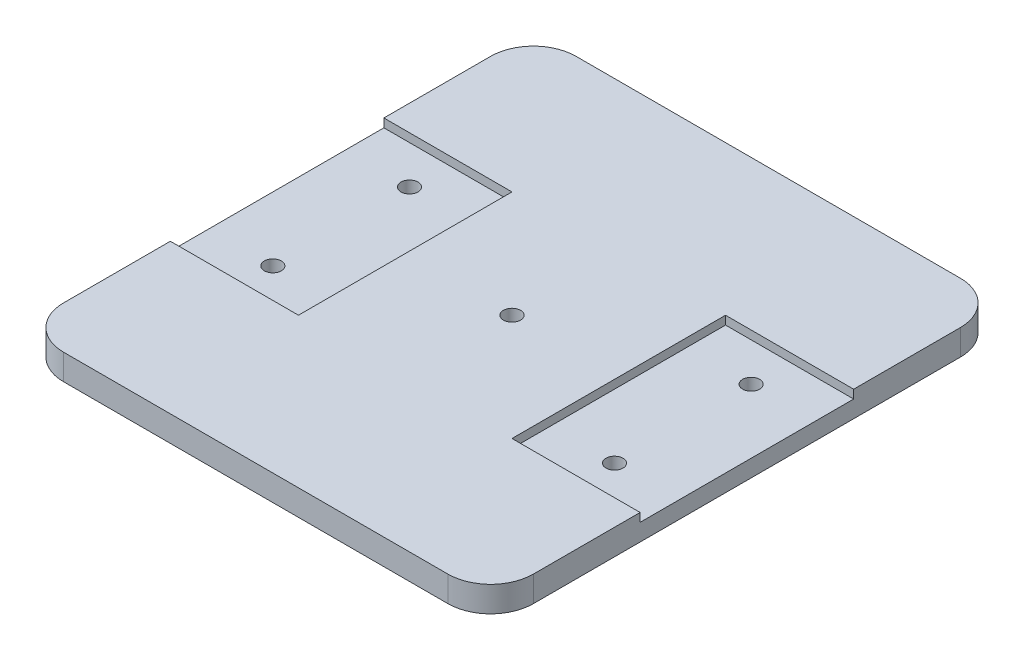
ISO-10303-21;
HEADER;
FILE_DESCRIPTION(('STEP AP214'),'2;1');
FILE_NAME('part.step','',(''),(''),'','','');
FILE_SCHEMA(('AUTOMOTIVE_DESIGN { 1 0 10303 214 1 1 1 1 }'));
ENDSEC;
DATA;
#1=APPLICATION_CONTEXT('core data for automotive mechanical design processes');
#2=APPLICATION_PROTOCOL_DEFINITION('international standard','automotive_design',2000,#1);
#3=PRODUCT_CONTEXT('',#1,'mechanical');
#4=PRODUCT('Part','Part','',(#3));
#5=PRODUCT_RELATED_PRODUCT_CATEGORY('part','',(#4));
#6=PRODUCT_DEFINITION_FORMATION('','',#4);
#7=PRODUCT_DEFINITION_CONTEXT('part definition',#1,'design');
#8=PRODUCT_DEFINITION('design','',#6,#7);
#9=PRODUCT_DEFINITION_SHAPE('','',#8);
#10=(LENGTH_UNIT() NAMED_UNIT(*) SI_UNIT(.MILLI.,.METRE.));
#11=(NAMED_UNIT(*) PLANE_ANGLE_UNIT() SI_UNIT($,.RADIAN.));
#12=(NAMED_UNIT(*) SI_UNIT($,.STERADIAN.) SOLID_ANGLE_UNIT());
#13=UNCERTAINTY_MEASURE_WITH_UNIT(LENGTH_MEASURE(1.E-05),#10,'distance_accuracy_value','');
#14=(GEOMETRIC_REPRESENTATION_CONTEXT(3) GLOBAL_UNCERTAINTY_ASSIGNED_CONTEXT((#13)) GLOBAL_UNIT_ASSIGNED_CONTEXT((#10,
#11,#12)) REPRESENTATION_CONTEXT('',''));
#15=CARTESIAN_POINT('',(0.,0.,0.));
#16=DIRECTION('',(0.,0.,1.));
#17=DIRECTION('',(1.,0.,0.));
#18=AXIS2_PLACEMENT_3D('',#15,#16,#17);
#19=CARTESIAN_POINT('',(-78.125,3.,-24.375));
#20=DIRECTION('',(1.,0.,0.));
#21=DIRECTION('',(0.,0.,-1.));
#22=AXIS2_PLACEMENT_3D('',#19,#20,#21);
#23=PLANE('',#22);
#24=DIRECTION('',(0.,0.,1.));
#25=VECTOR('',#24,1.);
#26=CARTESIAN_POINT('',(-78.125,3.,-24.375));
#27=LINE('',#26,#25);
#28=CARTESIAN_POINT('',(-78.125,3.,-19.375));
#29=VERTEX_POINT('',#28);
#30=CARTESIAN_POINT('',(-78.125,3.,-6.875));
#31=VERTEX_POINT('',#30);
#32=EDGE_CURVE('E243',#29,#31,#27,.T.);
#33=ORIENTED_EDGE('',*,*,#32,.F.);
#34=DIRECTION('',(0.,-1.,0.));
#35=VECTOR('',#34,1.);
#36=CARTESIAN_POINT('',(-78.125,3.,-19.375));
#37=LINE('',#36,#35);
#38=CARTESIAN_POINT('',(-78.125,0.,-19.375));
#39=VERTEX_POINT('',#38);
#40=EDGE_CURVE('E283',#29,#39,#37,.T.);
#41=ORIENTED_EDGE('',*,*,#40,.T.);
#42=DIRECTION('',(0.,0.,1.));
#43=VECTOR('',#42,1.);
#44=CARTESIAN_POINT('',(-78.125,0.,-24.375));
#45=LINE('',#44,#43);
#46=CARTESIAN_POINT('',(-78.125,0.,30.625));
#47=VERTEX_POINT('',#46);
#48=EDGE_CURVE('E234',#39,#47,#45,.T.);
#49=ORIENTED_EDGE('',*,*,#48,.T.);
#50=DIRECTION('',(0.,-1.,0.));
#51=VECTOR('',#50,1.);
#52=CARTESIAN_POINT('',(-78.125,3.,30.625));
#53=LINE('',#52,#51);
#54=CARTESIAN_POINT('',(-78.125,3.,30.625));
#55=VERTEX_POINT('',#54);
#56=EDGE_CURVE('E259',#47,#55,#53,.F.);
#57=ORIENTED_EDGE('',*,*,#56,.T.);
#58=CARTESIAN_POINT('',(-78.125,3.,18.125));
#59=VERTEX_POINT('',#58);
#60=EDGE_CURVE('E247',#59,#55,#27,.T.);
#61=ORIENTED_EDGE('',*,*,#60,.F.);
#62=DIRECTION('',(0.,1.,0.));
#63=VECTOR('',#62,1.);
#64=CARTESIAN_POINT('',(-78.125,2.,18.125));
#65=LINE('',#64,#63);
#66=CARTESIAN_POINT('',(-78.125,2.,18.125));
#67=VERTEX_POINT('',#66);
#68=EDGE_CURVE('E219',#67,#59,#65,.T.);
#69=ORIENTED_EDGE('',*,*,#68,.F.);
#70=DIRECTION('',(0.,0.,1.));
#71=VECTOR('',#70,1.);
#72=CARTESIAN_POINT('',(-78.125,2.,-6.875));
#73=LINE('',#72,#71);
#74=CARTESIAN_POINT('',(-78.125,2.,-6.875));
#75=VERTEX_POINT('',#74);
#76=EDGE_CURVE('E202',#75,#67,#73,.T.);
#77=ORIENTED_EDGE('',*,*,#76,.F.);
#78=DIRECTION('',(0.,1.,0.));
#79=VECTOR('',#78,1.);
#80=CARTESIAN_POINT('',(-78.125,2.,-6.875));
#81=LINE('',#80,#79);
#82=EDGE_CURVE('E230',#75,#31,#81,.T.);
#83=ORIENTED_EDGE('',*,*,#82,.T.);
#84=EDGE_LOOP('',(#33,#41,#49,#57,#61,#69,#77,#83));
#85=FACE_BOUND('',#84,.T.);
#86=ADVANCED_FACE('F42',(#85),#23,.F.);
#87=CARTESIAN_POINT('',(-78.125,3.,35.625));
#88=DIRECTION('',(0.,0.,-1.));
#89=DIRECTION('',(-1.,0.,0.));
#90=AXIS2_PLACEMENT_3D('',#87,#88,#89);
#91=PLANE('',#90);
#92=DIRECTION('',(1.,0.,0.));
#93=VECTOR('',#92,1.);
#94=CARTESIAN_POINT('',(-78.125,0.,35.625));
#95=LINE('',#94,#93);
#96=CARTESIAN_POINT('',(-73.125,0.,35.625));
#97=VERTEX_POINT('',#96);
#98=CARTESIAN_POINT('',(-28.125,0.,35.625));
#99=VERTEX_POINT('',#98);
#100=EDGE_CURVE('E263',#97,#99,#95,.T.);
#101=ORIENTED_EDGE('',*,*,#100,.T.);
#102=DIRECTION('',(0.,-1.,0.));
#103=VECTOR('',#102,1.);
#104=CARTESIAN_POINT('',(-28.125,3.,35.625));
#105=LINE('',#104,#103);
#106=CARTESIAN_POINT('',(-28.125,3.,35.625));
#107=VERTEX_POINT('',#106);
#108=EDGE_CURVE('E11',#99,#107,#105,.F.);
#109=ORIENTED_EDGE('',*,*,#108,.T.);
#110=DIRECTION('',(1.,0.,0.));
#111=VECTOR('',#110,1.);
#112=CARTESIAN_POINT('',(-78.125,3.,35.625));
#113=LINE('',#112,#111);
#114=CARTESIAN_POINT('',(-73.125,3.,35.625));
#115=VERTEX_POINT('',#114);
#116=EDGE_CURVE('E246',#115,#107,#113,.T.);
#117=ORIENTED_EDGE('',*,*,#116,.F.);
#118=DIRECTION('',(0.,-1.,0.));
#119=VECTOR('',#118,1.);
#120=CARTESIAN_POINT('',(-73.125,3.,35.625));
#121=LINE('',#120,#119);
#122=EDGE_CURVE('E52',#115,#97,#121,.T.);
#123=ORIENTED_EDGE('',*,*,#122,.T.);
#124=EDGE_LOOP('',(#101,#109,#117,#123));
#125=FACE_BOUND('',#124,.T.);
#126=ADVANCED_FACE('F331',(#125),#91,.F.);
#127=CARTESIAN_POINT('',(-23.125,3.,-24.375));
#128=DIRECTION('',(-1.,0.,0.));
#129=DIRECTION('',(0.,0.,1.));
#130=AXIS2_PLACEMENT_3D('',#127,#128,#129);
#131=PLANE('',#130);
#132=DIRECTION('',(0.,0.,-1.));
#133=VECTOR('',#132,1.);
#134=CARTESIAN_POINT('',(-23.125,2.,-6.875));
#135=LINE('',#134,#133);
#136=CARTESIAN_POINT('',(-23.125,2.,18.125));
#137=VERTEX_POINT('',#136);
#138=CARTESIAN_POINT('',(-23.125,2.,-6.875));
#139=VERTEX_POINT('',#138);
#140=EDGE_CURVE('E164',#137,#139,#135,.T.);
#141=ORIENTED_EDGE('',*,*,#140,.F.);
#142=DIRECTION('',(0.,1.,0.));
#143=VECTOR('',#142,1.);
#144=CARTESIAN_POINT('',(-23.125,2.,18.125));
#145=LINE('',#144,#143);
#146=CARTESIAN_POINT('',(-23.125,3.,18.125));
#147=VERTEX_POINT('',#146);
#148=EDGE_CURVE('E190',#137,#147,#145,.T.);
#149=ORIENTED_EDGE('',*,*,#148,.T.);
#150=DIRECTION('',(0.,0.,-1.));
#151=VECTOR('',#150,1.);
#152=CARTESIAN_POINT('',(-23.125,3.,-24.375));
#153=LINE('',#152,#151);
#154=CARTESIAN_POINT('',(-23.125,3.,30.625));
#155=VERTEX_POINT('',#154);
#156=EDGE_CURVE('E251',#155,#147,#153,.T.);
#157=ORIENTED_EDGE('',*,*,#156,.F.);
#158=DIRECTION('',(0.,-1.,0.));
#159=VECTOR('',#158,1.);
#160=CARTESIAN_POINT('',(-23.125,3.,30.625));
#161=LINE('',#160,#159);
#162=CARTESIAN_POINT('',(-23.125,0.,30.625));
#163=VERTEX_POINT('',#162);
#164=EDGE_CURVE('E318',#155,#163,#161,.T.);
#165=ORIENTED_EDGE('',*,*,#164,.T.);
#166=DIRECTION('',(0.,0.,-1.));
#167=VECTOR('',#166,1.);
#168=CARTESIAN_POINT('',(-23.125,0.,-24.375));
#169=LINE('',#168,#167);
#170=CARTESIAN_POINT('',(-23.125,0.,-19.375));
#171=VERTEX_POINT('',#170);
#172=EDGE_CURVE('E267',#163,#171,#169,.T.);
#173=ORIENTED_EDGE('',*,*,#172,.T.);
#174=DIRECTION('',(0.,-1.,0.));
#175=VECTOR('',#174,1.);
#176=CARTESIAN_POINT('',(-23.125,3.,-19.375));
#177=LINE('',#176,#175);
#178=CARTESIAN_POINT('',(-23.125,3.,-19.375));
#179=VERTEX_POINT('',#178);
#180=EDGE_CURVE('E322',#171,#179,#177,.F.);
#181=ORIENTED_EDGE('',*,*,#180,.T.);
#182=CARTESIAN_POINT('',(-23.125,3.,-6.875));
#183=VERTEX_POINT('',#182);
#184=EDGE_CURVE('E66',#183,#179,#153,.T.);
#185=ORIENTED_EDGE('',*,*,#184,.F.);
#186=DIRECTION('',(0.,1.,0.));
#187=VECTOR('',#186,1.);
#188=CARTESIAN_POINT('',(-23.125,2.,-6.875));
#189=LINE('',#188,#187);
#190=EDGE_CURVE('E59',#139,#183,#189,.T.);
#191=ORIENTED_EDGE('',*,*,#190,.F.);
#192=EDGE_LOOP('',(#141,#149,#157,#165,#173,#181,#185,#191));
#193=FACE_BOUND('',#192,.T.);
#194=ADVANCED_FACE('F176',(#193),#131,.F.);
#195=CARTESIAN_POINT('',(-78.125,3.,-24.375));
#196=DIRECTION('',(0.,0.,1.));
#197=DIRECTION('',(1.,0.,0.));
#198=AXIS2_PLACEMENT_3D('',#195,#196,#197);
#199=PLANE('',#198);
#200=DIRECTION('',(-1.,0.,0.));
#201=VECTOR('',#200,1.);
#202=CARTESIAN_POINT('',(-78.125,0.,-24.375));
#203=LINE('',#202,#201);
#204=CARTESIAN_POINT('',(-28.125,0.,-24.375));
#205=VERTEX_POINT('',#204);
#206=CARTESIAN_POINT('',(-73.125,0.,-24.375));
#207=VERTEX_POINT('',#206);
#208=EDGE_CURVE('E271',#205,#207,#203,.T.);
#209=ORIENTED_EDGE('',*,*,#208,.T.);
#210=DIRECTION('',(0.,-1.,0.));
#211=VECTOR('',#210,1.);
#212=CARTESIAN_POINT('',(-73.125,3.,-24.375));
#213=LINE('',#212,#211);
#214=CARTESIAN_POINT('',(-73.125,3.,-24.375));
#215=VERTEX_POINT('',#214);
#216=EDGE_CURVE('E303',#207,#215,#213,.F.);
#217=ORIENTED_EDGE('',*,*,#216,.T.);
#218=DIRECTION('',(-1.,0.,0.));
#219=VECTOR('',#218,1.);
#220=CARTESIAN_POINT('',(-78.125,3.,-24.375));
#221=LINE('',#220,#219);
#222=CARTESIAN_POINT('',(-28.125,3.,-24.375));
#223=VERTEX_POINT('',#222);
#224=EDGE_CURVE('E255',#223,#215,#221,.T.);
#225=ORIENTED_EDGE('',*,*,#224,.F.);
#226=DIRECTION('',(0.,-1.,0.));
#227=VECTOR('',#226,1.);
#228=CARTESIAN_POINT('',(-28.125,3.,-24.375));
#229=LINE('',#228,#227);
#230=EDGE_CURVE('E299',#223,#205,#229,.T.);
#231=ORIENTED_EDGE('',*,*,#230,.T.);
#232=EDGE_LOOP('',(#209,#217,#225,#231));
#233=FACE_BOUND('',#232,.T.);
#234=ADVANCED_FACE('F361',(#233),#199,.F.);
#235=CARTESIAN_POINT('',(0.,3.,0.));
#236=DIRECTION('',(0.,1.,0.));
#237=DIRECTION('',(0.,0.,1.));
#238=AXIS2_PLACEMENT_3D('',#235,#236,#237);
#239=PLANE('',#238);
#240=DIRECTION('',(1.,0.,0.));
#241=VECTOR('',#240,1.);
#242=CARTESIAN_POINT('',(-23.125,3.,18.125));
#243=LINE('',#242,#241);
#244=CARTESIAN_POINT('',(-38.125,3.,18.125));
#245=VERTEX_POINT('',#244);
#246=EDGE_CURVE('E174',#245,#147,#243,.T.);
#247=ORIENTED_EDGE('',*,*,#246,.F.);
#248=DIRECTION('',(0.,0.,1.));
#249=VECTOR('',#248,1.);
#250=CARTESIAN_POINT('',(-38.125,3.,-6.875));
#251=LINE('',#250,#249);
#252=CARTESIAN_POINT('',(-38.125,3.,-6.875));
#253=VERTEX_POINT('',#252);
#254=EDGE_CURVE('E653',#253,#245,#251,.T.);
#255=ORIENTED_EDGE('',*,*,#254,.F.);
#256=DIRECTION('',(-1.,0.,0.));
#257=VECTOR('',#256,1.);
#258=CARTESIAN_POINT('',(-23.125,3.,-6.875));
#259=LINE('',#258,#257);
#260=EDGE_CURVE('E640',#183,#253,#259,.T.);
#261=ORIENTED_EDGE('',*,*,#260,.F.);
#262=ORIENTED_EDGE('',*,*,#184,.T.);
#263=CARTESIAN_POINT('',(-28.125,3.,-19.375));
#264=DIRECTION('',(0.,1.,0.));
#265=DIRECTION('',(0.,0.,1.));
#266=AXIS2_PLACEMENT_3D('',#263,#264,#265);
#267=CIRCLE('',#266,5.);
#268=EDGE_CURVE('E312',#179,#223,#267,.T.);
#269=ORIENTED_EDGE('',*,*,#268,.T.);
#270=ORIENTED_EDGE('',*,*,#224,.T.);
#271=CARTESIAN_POINT('',(-73.125,3.,-19.375));
#272=DIRECTION('',(0.,1.,0.));
#273=DIRECTION('',(0.,0.,1.));
#274=AXIS2_PLACEMENT_3D('',#271,#272,#273);
#275=CIRCLE('',#274,5.);
#276=EDGE_CURVE('E315',#215,#29,#275,.T.);
#277=ORIENTED_EDGE('',*,*,#276,.T.);
#278=ORIENTED_EDGE('',*,*,#32,.T.);
#279=DIRECTION('',(-1.,0.,0.));
#280=VECTOR('',#279,1.);
#281=CARTESIAN_POINT('',(-78.125,3.,-6.875));
#282=LINE('',#281,#280);
#283=CARTESIAN_POINT('',(-63.125,3.,-6.875));
#284=VERTEX_POINT('',#283);
#285=EDGE_CURVE('E207',#284,#31,#282,.T.);
#286=ORIENTED_EDGE('',*,*,#285,.F.);
#287=DIRECTION('',(0.,0.,-1.));
#288=VECTOR('',#287,1.);
#289=CARTESIAN_POINT('',(-63.125,3.,-6.875));
#290=LINE('',#289,#288);
#291=CARTESIAN_POINT('',(-63.125,3.,18.125));
#292=VERTEX_POINT('',#291);
#293=EDGE_CURVE('E223',#292,#284,#290,.T.);
#294=ORIENTED_EDGE('',*,*,#293,.F.);
#295=DIRECTION('',(1.,0.,0.));
#296=VECTOR('',#295,1.);
#297=CARTESIAN_POINT('',(-78.125,3.,18.125));
#298=LINE('',#297,#296);
#299=EDGE_CURVE('E201',#59,#292,#298,.T.);
#300=ORIENTED_EDGE('',*,*,#299,.F.);
#301=ORIENTED_EDGE('',*,*,#60,.T.);
#302=CARTESIAN_POINT('',(-73.125,3.,30.625));
#303=DIRECTION('',(0.,1.,0.));
#304=DIRECTION('',(0.,0.,1.));
#305=AXIS2_PLACEMENT_3D('',#302,#303,#304);
#306=CIRCLE('',#305,5.);
#307=EDGE_CURVE('E306',#55,#115,#306,.T.);
#308=ORIENTED_EDGE('',*,*,#307,.T.);
#309=ORIENTED_EDGE('',*,*,#116,.T.);
#310=CARTESIAN_POINT('',(-28.125,3.,30.625));
#311=DIRECTION('',(0.,1.,0.));
#312=DIRECTION('',(0.,0.,1.));
#313=AXIS2_PLACEMENT_3D('',#310,#311,#312);
#314=CIRCLE('',#313,5.);
#315=EDGE_CURVE('E309',#107,#155,#314,.T.);
#316=ORIENTED_EDGE('',*,*,#315,.T.);
#317=ORIENTED_EDGE('',*,*,#156,.T.);
#318=EDGE_LOOP('',(#247,#255,#261,#262,#269,#270,#277,#278,#286,#294,#300,#301,#308,#309,#316,#317));
#319=FACE_BOUND('',#318,.T.);
#320=CARTESIAN_POINT('',(-50.625,3.,5.625));
#321=DIRECTION('',(0.,1.,0.));
#322=DIRECTION('',(0.,0.,1.));
#323=AXIS2_PLACEMENT_3D('',#320,#321,#322);
#324=CIRCLE('',#323,0.999999999999998);
#325=CARTESIAN_POINT('',(-50.625,3.,6.625));
#326=VERTEX_POINT('',#325);
#327=EDGE_CURVE('E186',#326,#326,#324,.T.);
#328=ORIENTED_EDGE('',*,*,#327,.F.);
#329=EDGE_LOOP('',(#328));
#330=FACE_BOUND('',#329,.T.);
#331=ADVANCED_FACE('F346',(#319,#330),#239,.T.);
#332=CARTESIAN_POINT('',(0.,0.,0.));
#333=DIRECTION('',(0.,1.,0.));
#334=DIRECTION('',(0.,0.,1.));
#335=AXIS2_PLACEMENT_3D('',#332,#333,#334);
#336=PLANE('',#335);
#337=CARTESIAN_POINT('',(-30.625,0.,-2.375));
#338=DIRECTION('',(0.,1.,0.));
#339=DIRECTION('',(0.,0.,1.));
#340=AXIS2_PLACEMENT_3D('',#337,#338,#339);
#341=CIRCLE('',#340,1.);
#342=CARTESIAN_POINT('',(-30.625,0.,-1.375));
#343=VERTEX_POINT('',#342);
#344=EDGE_CURVE('E631',#343,#343,#341,.T.);
#345=ORIENTED_EDGE('',*,*,#344,.T.);
#346=EDGE_LOOP('',(#345));
#347=FACE_BOUND('',#346,.T.);
#348=CARTESIAN_POINT('',(-30.625,0.,13.625));
#349=DIRECTION('',(0.,1.,0.));
#350=DIRECTION('',(0.,0.,1.));
#351=AXIS2_PLACEMENT_3D('',#348,#349,#350);
#352=CIRCLE('',#351,1.);
#353=CARTESIAN_POINT('',(-30.625,0.,14.625));
#354=VERTEX_POINT('',#353);
#355=EDGE_CURVE('E643',#354,#354,#352,.T.);
#356=ORIENTED_EDGE('',*,*,#355,.T.);
#357=EDGE_LOOP('',(#356));
#358=FACE_BOUND('',#357,.T.);
#359=CARTESIAN_POINT('',(-50.625,0.,5.625));
#360=DIRECTION('',(0.,1.,0.));
#361=DIRECTION('',(0.,0.,1.));
#362=AXIS2_PLACEMENT_3D('',#359,#360,#361);
#363=CIRCLE('',#362,0.999999999999998);
#364=CARTESIAN_POINT('',(-50.625,0.,6.625));
#365=VERTEX_POINT('',#364);
#366=EDGE_CURVE('E46',#365,#365,#363,.T.);
#367=ORIENTED_EDGE('',*,*,#366,.T.);
#368=EDGE_LOOP('',(#367));
#369=FACE_BOUND('',#368,.T.);
#370=CARTESIAN_POINT('',(-70.625,0.,-2.375));
#371=DIRECTION('',(0.,1.,0.));
#372=DIRECTION('',(0.,0.,1.));
#373=AXIS2_PLACEMENT_3D('',#370,#371,#372);
#374=CIRCLE('',#373,0.999999999999998);
#375=CARTESIAN_POINT('',(-70.625,0.,-1.375));
#376=VERTEX_POINT('',#375);
#377=EDGE_CURVE('E197',#376,#376,#374,.T.);
#378=ORIENTED_EDGE('',*,*,#377,.T.);
#379=EDGE_LOOP('',(#378));
#380=FACE_BOUND('',#379,.T.);
#381=CARTESIAN_POINT('',(-70.625,0.,13.625));
#382=DIRECTION('',(0.,1.,0.));
#383=DIRECTION('',(0.,0.,1.));
#384=AXIS2_PLACEMENT_3D('',#381,#382,#383);
#385=CIRCLE('',#384,0.999999999999998);
#386=CARTESIAN_POINT('',(-70.625,0.,14.625));
#387=VERTEX_POINT('',#386);
#388=EDGE_CURVE('E191',#387,#387,#385,.T.);
#389=ORIENTED_EDGE('',*,*,#388,.T.);
#390=EDGE_LOOP('',(#389));
#391=FACE_BOUND('',#390,.T.);
#392=ORIENTED_EDGE('',*,*,#48,.F.);
#393=CARTESIAN_POINT('',(-73.125,0.,-19.375));
#394=DIRECTION('',(0.,1.,0.));
#395=DIRECTION('',(0.,0.,1.));
#396=AXIS2_PLACEMENT_3D('',#393,#394,#395);
#397=CIRCLE('',#396,5.);
#398=EDGE_CURVE('E296',#39,#207,#397,.F.);
#399=ORIENTED_EDGE('',*,*,#398,.T.);
#400=ORIENTED_EDGE('',*,*,#208,.F.);
#401=CARTESIAN_POINT('',(-28.125,0.,-19.375));
#402=DIRECTION('',(0.,1.,0.));
#403=DIRECTION('',(0.,0.,1.));
#404=AXIS2_PLACEMENT_3D('',#401,#402,#403);
#405=CIRCLE('',#404,5.);
#406=EDGE_CURVE('E293',#205,#171,#405,.F.);
#407=ORIENTED_EDGE('',*,*,#406,.T.);
#408=ORIENTED_EDGE('',*,*,#172,.F.);
#409=CARTESIAN_POINT('',(-28.125,0.,30.625));
#410=DIRECTION('',(0.,1.,0.));
#411=DIRECTION('',(0.,0.,1.));
#412=AXIS2_PLACEMENT_3D('',#409,#410,#411);
#413=CIRCLE('',#412,5.);
#414=EDGE_CURVE('E290',#163,#99,#413,.F.);
#415=ORIENTED_EDGE('',*,*,#414,.T.);
#416=ORIENTED_EDGE('',*,*,#100,.F.);
#417=CARTESIAN_POINT('',(-73.125,0.,30.625));
#418=DIRECTION('',(0.,1.,0.));
#419=DIRECTION('',(0.,0.,1.));
#420=AXIS2_PLACEMENT_3D('',#417,#418,#419);
#421=CIRCLE('',#420,5.);
#422=EDGE_CURVE('E287',#97,#47,#421,.F.);
#423=ORIENTED_EDGE('',*,*,#422,.T.);
#424=EDGE_LOOP('',(#392,#399,#400,#407,#408,#415,#416,#423));
#425=FACE_BOUND('',#424,.T.);
#426=ADVANCED_FACE('F337',(#347,#358,#369,#380,#391,#425),#336,.F.);
#427=CARTESIAN_POINT('',(-78.125,2.,-6.875));
#428=DIRECTION('',(0.,0.,-1.));
#429=DIRECTION('',(-1.,0.,0.));
#430=AXIS2_PLACEMENT_3D('',#427,#428,#429);
#431=PLANE('',#430);
#432=ORIENTED_EDGE('',*,*,#285,.T.);
#433=ORIENTED_EDGE('',*,*,#82,.F.);
#434=DIRECTION('',(-1.,0.,0.));
#435=VECTOR('',#434,1.);
#436=CARTESIAN_POINT('',(-78.125,2.,-6.875));
#437=LINE('',#436,#435);
#438=CARTESIAN_POINT('',(-63.125,2.,-6.875));
#439=VERTEX_POINT('',#438);
#440=EDGE_CURVE('E215',#439,#75,#437,.T.);
#441=ORIENTED_EDGE('',*,*,#440,.F.);
#442=DIRECTION('',(0.,1.,0.));
#443=VECTOR('',#442,1.);
#444=CARTESIAN_POINT('',(-63.125,2.,-6.875));
#445=LINE('',#444,#443);
#446=EDGE_CURVE('E235',#439,#284,#445,.T.);
#447=ORIENTED_EDGE('',*,*,#446,.T.);
#448=EDGE_LOOP('',(#432,#433,#441,#447));
#449=FACE_BOUND('',#448,.T.);
#450=ADVANCED_FACE('F370',(#449),#431,.F.);
#451=CARTESIAN_POINT('',(-63.125,2.,-6.875));
#452=DIRECTION('',(1.,0.,0.));
#453=DIRECTION('',(0.,0.,-1.));
#454=AXIS2_PLACEMENT_3D('',#451,#452,#453);
#455=PLANE('',#454);
#456=ORIENTED_EDGE('',*,*,#293,.T.);
#457=ORIENTED_EDGE('',*,*,#446,.F.);
#458=DIRECTION('',(0.,0.,-1.));
#459=VECTOR('',#458,1.);
#460=CARTESIAN_POINT('',(-63.125,2.,-6.875));
#461=LINE('',#460,#459);
#462=CARTESIAN_POINT('',(-63.125,2.,18.125));
#463=VERTEX_POINT('',#462);
#464=EDGE_CURVE('E211',#463,#439,#461,.T.);
#465=ORIENTED_EDGE('',*,*,#464,.F.);
#466=DIRECTION('',(0.,1.,0.));
#467=VECTOR('',#466,1.);
#468=CARTESIAN_POINT('',(-63.125,2.,18.125));
#469=LINE('',#468,#467);
#470=EDGE_CURVE('E238',#463,#292,#469,.T.);
#471=ORIENTED_EDGE('',*,*,#470,.T.);
#472=EDGE_LOOP('',(#456,#457,#465,#471));
#473=FACE_BOUND('',#472,.T.);
#474=ADVANCED_FACE('F375',(#473),#455,.F.);
#475=CARTESIAN_POINT('',(-78.125,2.,18.125));
#476=DIRECTION('',(0.,0.,1.));
#477=DIRECTION('',(1.,0.,0.));
#478=AXIS2_PLACEMENT_3D('',#475,#476,#477);
#479=PLANE('',#478);
#480=ORIENTED_EDGE('',*,*,#299,.T.);
#481=ORIENTED_EDGE('',*,*,#470,.F.);
#482=DIRECTION('',(1.,0.,0.));
#483=VECTOR('',#482,1.);
#484=CARTESIAN_POINT('',(-78.125,2.,18.125));
#485=LINE('',#484,#483);
#486=EDGE_CURVE('E206',#67,#463,#485,.T.);
#487=ORIENTED_EDGE('',*,*,#486,.F.);
#488=ORIENTED_EDGE('',*,*,#68,.T.);
#489=EDGE_LOOP('',(#480,#481,#487,#488));
#490=FACE_BOUND('',#489,.T.);
#491=ADVANCED_FACE('F378',(#490),#479,.F.);
#492=CARTESIAN_POINT('',(0.,2.,0.));
#493=DIRECTION('',(0.,1.,0.));
#494=DIRECTION('',(0.,0.,1.));
#495=AXIS2_PLACEMENT_3D('',#492,#493,#494);
#496=PLANE('',#495);
#497=CARTESIAN_POINT('',(-70.625,2.,-2.375));
#498=DIRECTION('',(0.,1.,0.));
#499=DIRECTION('',(0.,0.,1.));
#500=AXIS2_PLACEMENT_3D('',#497,#498,#499);
#501=CIRCLE('',#500,0.999999999999998);
#502=CARTESIAN_POINT('',(-70.625,2.,-1.375));
#503=VERTEX_POINT('',#502);
#504=EDGE_CURVE('E195',#503,#503,#501,.T.);
#505=ORIENTED_EDGE('',*,*,#504,.F.);
#506=EDGE_LOOP('',(#505));
#507=FACE_BOUND('',#506,.T.);
#508=CARTESIAN_POINT('',(-70.625,2.,13.625));
#509=DIRECTION('',(0.,1.,0.));
#510=DIRECTION('',(0.,0.,1.));
#511=AXIS2_PLACEMENT_3D('',#508,#509,#510);
#512=CIRCLE('',#511,0.999999999999998);
#513=CARTESIAN_POINT('',(-70.625,2.,14.625));
#514=VERTEX_POINT('',#513);
#515=EDGE_CURVE('E196',#514,#514,#512,.T.);
#516=ORIENTED_EDGE('',*,*,#515,.F.);
#517=EDGE_LOOP('',(#516));
#518=FACE_BOUND('',#517,.T.);
#519=ORIENTED_EDGE('',*,*,#76,.T.);
#520=ORIENTED_EDGE('',*,*,#486,.T.);
#521=ORIENTED_EDGE('',*,*,#464,.T.);
#522=ORIENTED_EDGE('',*,*,#440,.T.);
#523=EDGE_LOOP('',(#519,#520,#521,#522));
#524=FACE_BOUND('',#523,.T.);
#525=ADVANCED_FACE('F372',(#507,#518,#524),#496,.T.);
#526=CARTESIAN_POINT('',(-70.625,-2.,13.625));
#527=DIRECTION('',(0.,1.,0.));
#528=DIRECTION('',(0.,0.,1.));
#529=AXIS2_PLACEMENT_3D('',#526,#527,#528);
#530=CYLINDRICAL_SURFACE('',#529,0.999999999999998);
#531=ORIENTED_EDGE('',*,*,#515,.T.);
#532=EDGE_LOOP('',(#531));
#533=FACE_BOUND('',#532,.T.);
#534=ORIENTED_EDGE('',*,*,#388,.F.);
#535=EDGE_LOOP('',(#534));
#536=FACE_BOUND('',#535,.T.);
#537=ADVANCED_FACE('F385',(#533,#536),#530,.F.);
#538=CARTESIAN_POINT('',(-70.625,-2.,-2.375));
#539=DIRECTION('',(0.,1.,0.));
#540=DIRECTION('',(0.,0.,1.));
#541=AXIS2_PLACEMENT_3D('',#538,#539,#540);
#542=CYLINDRICAL_SURFACE('',#541,0.999999999999998);
#543=ORIENTED_EDGE('',*,*,#504,.T.);
#544=EDGE_LOOP('',(#543));
#545=FACE_BOUND('',#544,.T.);
#546=ORIENTED_EDGE('',*,*,#377,.F.);
#547=EDGE_LOOP('',(#546));
#548=FACE_BOUND('',#547,.T.);
#549=ADVANCED_FACE('F401',(#545,#548),#542,.F.);
#550=CARTESIAN_POINT('',(-73.125,3.,-19.375));
#551=DIRECTION('',(0.,-1.,0.));
#552=DIRECTION('',(0.,0.,-1.));
#553=AXIS2_PLACEMENT_3D('',#550,#551,#552);
#554=CYLINDRICAL_SURFACE('',#553,5.);
#555=ORIENTED_EDGE('',*,*,#276,.F.);
#556=ORIENTED_EDGE('',*,*,#216,.F.);
#557=ORIENTED_EDGE('',*,*,#398,.F.);
#558=ORIENTED_EDGE('',*,*,#40,.F.);
#559=EDGE_LOOP('',(#555,#556,#557,#558));
#560=FACE_BOUND('',#559,.T.);
#561=ADVANCED_FACE('F365',(#560),#554,.T.);
#562=CARTESIAN_POINT('',(-28.125,3.,-19.375));
#563=DIRECTION('',(0.,-1.,0.));
#564=DIRECTION('',(0.,0.,-1.));
#565=AXIS2_PLACEMENT_3D('',#562,#563,#564);
#566=CYLINDRICAL_SURFACE('',#565,5.);
#567=ORIENTED_EDGE('',*,*,#268,.F.);
#568=ORIENTED_EDGE('',*,*,#180,.F.);
#569=ORIENTED_EDGE('',*,*,#406,.F.);
#570=ORIENTED_EDGE('',*,*,#230,.F.);
#571=EDGE_LOOP('',(#567,#568,#569,#570));
#572=FACE_BOUND('',#571,.T.);
#573=ADVANCED_FACE('F400',(#572),#566,.T.);
#574=CARTESIAN_POINT('',(-28.125,3.,30.625));
#575=DIRECTION('',(0.,-1.,0.));
#576=DIRECTION('',(0.,0.,-1.));
#577=AXIS2_PLACEMENT_3D('',#574,#575,#576);
#578=CYLINDRICAL_SURFACE('',#577,5.);
#579=ORIENTED_EDGE('',*,*,#315,.F.);
#580=ORIENTED_EDGE('',*,*,#108,.F.);
#581=ORIENTED_EDGE('',*,*,#414,.F.);
#582=ORIENTED_EDGE('',*,*,#164,.F.);
#583=EDGE_LOOP('',(#579,#580,#581,#582));
#584=FACE_BOUND('',#583,.T.);
#585=ADVANCED_FACE('F342',(#584),#578,.T.);
#586=CARTESIAN_POINT('',(-73.125,3.,30.625));
#587=DIRECTION('',(0.,-1.,0.));
#588=DIRECTION('',(0.,0.,-1.));
#589=AXIS2_PLACEMENT_3D('',#586,#587,#588);
#590=CYLINDRICAL_SURFACE('',#589,5.);
#591=ORIENTED_EDGE('',*,*,#307,.F.);
#592=ORIENTED_EDGE('',*,*,#56,.F.);
#593=ORIENTED_EDGE('',*,*,#422,.F.);
#594=ORIENTED_EDGE('',*,*,#122,.F.);
#595=EDGE_LOOP('',(#591,#592,#593,#594));
#596=FACE_BOUND('',#595,.T.);
#597=ADVANCED_FACE('F44',(#596),#590,.T.);
#598=CARTESIAN_POINT('',(-50.625,-2.,5.625));
#599=DIRECTION('',(0.,1.,0.));
#600=DIRECTION('',(0.,0.,1.));
#601=AXIS2_PLACEMENT_3D('',#598,#599,#600);
#602=CYLINDRICAL_SURFACE('',#601,0.999999999999998);
#603=ORIENTED_EDGE('',*,*,#327,.T.);
#604=EDGE_LOOP('',(#603));
#605=FACE_BOUND('',#604,.T.);
#606=ORIENTED_EDGE('',*,*,#366,.F.);
#607=EDGE_LOOP('',(#606));
#608=FACE_BOUND('',#607,.T.);
#609=ADVANCED_FACE('F408',(#605,#608),#602,.F.);
#610=CARTESIAN_POINT('',(-23.125,2.,18.125));
#611=DIRECTION('',(0.,0.,1.));
#612=DIRECTION('',(1.,0.,0.));
#613=AXIS2_PLACEMENT_3D('',#610,#611,#612);
#614=PLANE('',#613);
#615=ORIENTED_EDGE('',*,*,#246,.T.);
#616=ORIENTED_EDGE('',*,*,#148,.F.);
#617=DIRECTION('',(1.,0.,0.));
#618=VECTOR('',#617,1.);
#619=CARTESIAN_POINT('',(-23.125,2.,18.125));
#620=LINE('',#619,#618);
#621=CARTESIAN_POINT('',(-38.125,2.,18.125));
#622=VERTEX_POINT('',#621);
#623=EDGE_CURVE('E170',#622,#137,#620,.T.);
#624=ORIENTED_EDGE('',*,*,#623,.F.);
#625=DIRECTION('',(0.,1.,0.));
#626=VECTOR('',#625,1.);
#627=CARTESIAN_POINT('',(-38.125,2.,18.125));
#628=LINE('',#627,#626);
#629=EDGE_CURVE('E181',#622,#245,#628,.T.);
#630=ORIENTED_EDGE('',*,*,#629,.T.);
#631=EDGE_LOOP('',(#615,#616,#624,#630));
#632=FACE_BOUND('',#631,.T.);
#633=ADVANCED_FACE('F412',(#632),#614,.F.);
#634=CARTESIAN_POINT('',(-38.125,2.,-6.875));
#635=DIRECTION('',(-1.,0.,0.));
#636=DIRECTION('',(0.,0.,1.));
#637=AXIS2_PLACEMENT_3D('',#634,#635,#636);
#638=PLANE('',#637);
#639=ORIENTED_EDGE('',*,*,#254,.T.);
#640=ORIENTED_EDGE('',*,*,#629,.F.);
#641=DIRECTION('',(0.,0.,1.));
#642=VECTOR('',#641,1.);
#643=CARTESIAN_POINT('',(-38.125,2.,-6.875));
#644=LINE('',#643,#642);
#645=CARTESIAN_POINT('',(-38.125,2.,-6.875));
#646=VERTEX_POINT('',#645);
#647=EDGE_CURVE('E163',#646,#622,#644,.T.);
#648=ORIENTED_EDGE('',*,*,#647,.F.);
#649=DIRECTION('',(0.,1.,0.));
#650=VECTOR('',#649,1.);
#651=CARTESIAN_POINT('',(-38.125,2.,-6.875));
#652=LINE('',#651,#650);
#653=EDGE_CURVE('E158',#646,#253,#652,.T.);
#654=ORIENTED_EDGE('',*,*,#653,.T.);
#655=EDGE_LOOP('',(#639,#640,#648,#654));
#656=FACE_BOUND('',#655,.T.);
#657=ADVANCED_FACE('F418',(#656),#638,.F.);
#658=CARTESIAN_POINT('',(-23.125,2.,-6.875));
#659=DIRECTION('',(0.,0.,-1.));
#660=DIRECTION('',(-1.,0.,0.));
#661=AXIS2_PLACEMENT_3D('',#658,#659,#660);
#662=PLANE('',#661);
#663=ORIENTED_EDGE('',*,*,#260,.T.);
#664=ORIENTED_EDGE('',*,*,#653,.F.);
#665=DIRECTION('',(-1.,0.,0.));
#666=VECTOR('',#665,1.);
#667=CARTESIAN_POINT('',(-23.125,2.,-6.875));
#668=LINE('',#667,#666);
#669=EDGE_CURVE('E155',#139,#646,#668,.T.);
#670=ORIENTED_EDGE('',*,*,#669,.F.);
#671=ORIENTED_EDGE('',*,*,#190,.T.);
#672=EDGE_LOOP('',(#663,#664,#670,#671));
#673=FACE_BOUND('',#672,.T.);
#674=ADVANCED_FACE('F157',(#673),#662,.F.);
#675=CARTESIAN_POINT('',(0.,2.,0.));
#676=DIRECTION('',(0.,-1.,0.));
#677=DIRECTION('',(0.,0.,-1.));
#678=AXIS2_PLACEMENT_3D('',#675,#676,#677);
#679=PLANE('',#678);
#680=CARTESIAN_POINT('',(-30.625,2.,-2.375));
#681=DIRECTION('',(0.,1.,0.));
#682=DIRECTION('',(0.,0.,1.));
#683=AXIS2_PLACEMENT_3D('',#680,#681,#682);
#684=CIRCLE('',#683,1.);
#685=CARTESIAN_POINT('',(-30.625,2.,-1.375));
#686=VERTEX_POINT('',#685);
#687=EDGE_CURVE('E634',#686,#686,#684,.T.);
#688=ORIENTED_EDGE('',*,*,#687,.F.);
#689=EDGE_LOOP('',(#688));
#690=FACE_BOUND('',#689,.T.);
#691=CARTESIAN_POINT('',(-30.625,2.,13.625));
#692=DIRECTION('',(0.,1.,0.));
#693=DIRECTION('',(0.,0.,1.));
#694=AXIS2_PLACEMENT_3D('',#691,#692,#693);
#695=CIRCLE('',#694,1.);
#696=CARTESIAN_POINT('',(-30.625,2.,14.625));
#697=VERTEX_POINT('',#696);
#698=EDGE_CURVE('E636',#697,#697,#695,.T.);
#699=ORIENTED_EDGE('',*,*,#698,.F.);
#700=EDGE_LOOP('',(#699));
#701=FACE_BOUND('',#700,.T.);
#702=ORIENTED_EDGE('',*,*,#140,.T.);
#703=ORIENTED_EDGE('',*,*,#669,.T.);
#704=ORIENTED_EDGE('',*,*,#647,.T.);
#705=ORIENTED_EDGE('',*,*,#623,.T.);
#706=EDGE_LOOP('',(#702,#703,#704,#705));
#707=FACE_BOUND('',#706,.T.);
#708=ADVANCED_FACE('F168',(#690,#701,#707),#679,.F.);
#709=CARTESIAN_POINT('',(-30.625,0.,13.625));
#710=DIRECTION('',(0.,1.,0.));
#711=DIRECTION('',(0.,0.,1.));
#712=AXIS2_PLACEMENT_3D('',#709,#710,#711);
#713=CYLINDRICAL_SURFACE('',#712,1.);
#714=ORIENTED_EDGE('',*,*,#355,.F.);
#715=EDGE_LOOP('',(#714));
#716=FACE_BOUND('',#715,.T.);
#717=ORIENTED_EDGE('',*,*,#698,.T.);
#718=EDGE_LOOP('',(#717));
#719=FACE_BOUND('',#718,.T.);
#720=ADVANCED_FACE('F484',(#716,#719),#713,.F.);
#721=CARTESIAN_POINT('',(-30.625,0.,-2.375));
#722=DIRECTION('',(0.,1.,0.));
#723=DIRECTION('',(0.,0.,1.));
#724=AXIS2_PLACEMENT_3D('',#721,#722,#723);
#725=CYLINDRICAL_SURFACE('',#724,1.);
#726=ORIENTED_EDGE('',*,*,#344,.F.);
#727=EDGE_LOOP('',(#726));
#728=FACE_BOUND('',#727,.T.);
#729=ORIENTED_EDGE('',*,*,#687,.T.);
#730=EDGE_LOOP('',(#729));
#731=FACE_BOUND('',#730,.T.);
#732=ADVANCED_FACE('F491',(#728,#731),#725,.F.);
#733=CLOSED_SHELL('',(#86,#126,#194,#234,#331,#426,#450,#474,#491,#525,#537,#549,#561,#573,#585,
#597,#609,#633,#657,#674,#708,#720,#732));
#734=MANIFOLD_SOLID_BREP('B2',#733);
#735=ADVANCED_BREP_SHAPE_REPRESENTATION('',(#18,#734),#14);
#736=SHAPE_DEFINITION_REPRESENTATION(#9,#735);
ENDSEC;
END-ISO-10303-21;
